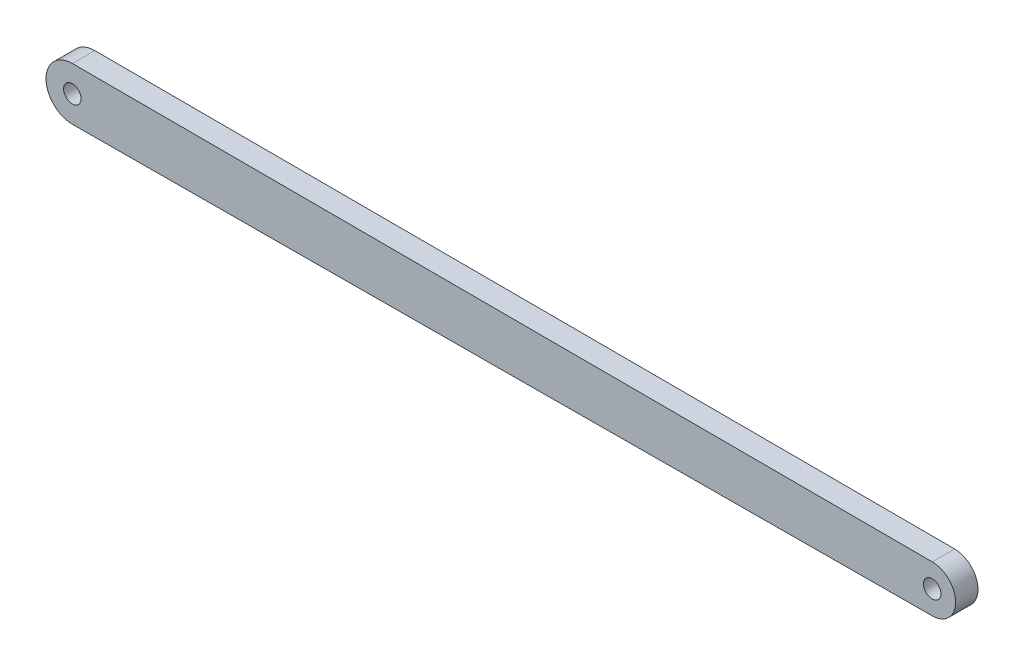
ISO-10303-21;
HEADER;
FILE_DESCRIPTION(('STEP AP214'),'2;1');
FILE_NAME('part.step','',(''),(''),'','','');
FILE_SCHEMA(('AUTOMOTIVE_DESIGN { 1 0 10303 214 1 1 1 1 }'));
ENDSEC;
DATA;
#1=APPLICATION_CONTEXT('core data for automotive mechanical design processes');
#2=APPLICATION_PROTOCOL_DEFINITION('international standard','automotive_design',2000,#1);
#3=PRODUCT_CONTEXT('',#1,'mechanical');
#4=PRODUCT('Part','Part','',(#3));
#5=PRODUCT_RELATED_PRODUCT_CATEGORY('part','',(#4));
#6=PRODUCT_DEFINITION_FORMATION('','',#4);
#7=PRODUCT_DEFINITION_CONTEXT('part definition',#1,'design');
#8=PRODUCT_DEFINITION('design','',#6,#7);
#9=PRODUCT_DEFINITION_SHAPE('','',#8);
#10=(LENGTH_UNIT() NAMED_UNIT(*) SI_UNIT(.MILLI.,.METRE.));
#11=(NAMED_UNIT(*) PLANE_ANGLE_UNIT() SI_UNIT($,.RADIAN.));
#12=(NAMED_UNIT(*) SI_UNIT($,.STERADIAN.) SOLID_ANGLE_UNIT());
#13=UNCERTAINTY_MEASURE_WITH_UNIT(LENGTH_MEASURE(1.E-05),#10,'distance_accuracy_value','');
#14=(GEOMETRIC_REPRESENTATION_CONTEXT(3) GLOBAL_UNCERTAINTY_ASSIGNED_CONTEXT((#13)) GLOBAL_UNIT_ASSIGNED_CONTEXT((#10,
#11,#12)) REPRESENTATION_CONTEXT('',''));
#15=CARTESIAN_POINT('',(0.,0.,0.));
#16=DIRECTION('',(0.,0.,1.));
#17=DIRECTION('',(1.,0.,0.));
#18=AXIS2_PLACEMENT_3D('',#15,#16,#17);
#19=CARTESIAN_POINT('',(-0.662328734431452,136.336625884489,6.35));
#20=DIRECTION('',(-0.00485798232582036,0.99998819993424,0.));
#21=DIRECTION('',(-0.99998819993424,-0.00485798232582036,0.));
#22=AXIS2_PLACEMENT_3D('',#19,#20,#21);
#23=PLANE('',#22);
#24=DIRECTION('',(0.99998819993424,0.00485798232582036,0.));
#25=VECTOR('',#24,1.);
#26=CARTESIAN_POINT('',(-0.662328734431452,136.336625884489,0.));
#27=LINE('',#26,#25);
#28=CARTESIAN_POINT('',(-142.715556523186,135.646525671338,0.));
#29=VERTEX_POINT('',#28);
#30=CARTESIAN_POINT('',(101.251015226787,136.83172495042,0.));
#31=VERTEX_POINT('',#30);
#32=EDGE_CURVE('E114',#29,#31,#27,.T.);
#33=ORIENTED_EDGE('',*,*,#32,.T.);
#34=DIRECTION('',(0.,0.,-1.));
#35=VECTOR('',#34,1.);
#36=CARTESIAN_POINT('',(101.251015226787,136.83172495042,6.35));
#37=LINE('',#36,#35);
#38=CARTESIAN_POINT('',(101.251015226787,136.83172495042,6.35));
#39=VERTEX_POINT('',#38);
#40=EDGE_CURVE('E11',#39,#31,#37,.T.);
#41=ORIENTED_EDGE('',*,*,#40,.F.);
#42=DIRECTION('',(0.99998819993424,0.00485798232582036,0.));
#43=VECTOR('',#42,1.);
#44=CARTESIAN_POINT('',(-0.662328734431452,136.336625884489,6.35));
#45=LINE('',#44,#43);
#46=CARTESIAN_POINT('',(-142.715556523186,135.646525671338,6.35));
#47=VERTEX_POINT('',#46);
#48=EDGE_CURVE('E93',#47,#39,#45,.T.);
#49=ORIENTED_EDGE('',*,*,#48,.F.);
#50=DIRECTION('',(0.,0.,-1.));
#51=VECTOR('',#50,1.);
#52=CARTESIAN_POINT('',(-142.715556523186,135.646525671338,6.35));
#53=LINE('',#52,#51);
#54=EDGE_CURVE('E113',#47,#29,#53,.T.);
#55=ORIENTED_EDGE('',*,*,#54,.T.);
#56=EDGE_LOOP('',(#33,#41,#49,#55));
#57=FACE_BOUND('',#56,.T.);
#58=ADVANCED_FACE('F45',(#57),#23,.F.);
#59=CARTESIAN_POINT('',(101.218768587839,143.469513289823,6.35));
#60=DIRECTION('',(0.,0.,-1.));
#61=DIRECTION('',(-1.,0.,0.));
#62=AXIS2_PLACEMENT_3D('',#59,#60,#61);
#63=CYLINDRICAL_SURFACE('',#62,6.63786666666665);
#64=CARTESIAN_POINT('',(101.218768587839,143.469513289823,0.));
#65=DIRECTION('',(0.,0.,1.));
#66=DIRECTION('',(1.,0.,0.));
#67=AXIS2_PLACEMENT_3D('',#64,#65,#66);
#68=CIRCLE('',#67,6.63786666666665);
#69=CARTESIAN_POINT('',(101.231672040621,150.107367414866,0.));
#70=VERTEX_POINT('',#69);
#71=EDGE_CURVE('E98',#31,#70,#68,.T.);
#72=ORIENTED_EDGE('',*,*,#71,.T.);
#73=DIRECTION('',(0.,0.,-1.));
#74=VECTOR('',#73,1.);
#75=CARTESIAN_POINT('',(101.231672040621,150.107367414866,6.35));
#76=LINE('',#75,#74);
#77=CARTESIAN_POINT('',(101.231672040621,150.107367414866,6.35));
#78=VERTEX_POINT('',#77);
#79=EDGE_CURVE('E53',#78,#70,#76,.T.);
#80=ORIENTED_EDGE('',*,*,#79,.F.);
#81=CARTESIAN_POINT('',(101.218768587839,143.469513289823,6.35));
#82=DIRECTION('',(0.,0.,1.));
#83=DIRECTION('',(1.,0.,0.));
#84=AXIS2_PLACEMENT_3D('',#81,#82,#83);
#85=CIRCLE('',#84,6.63786666666665);
#86=EDGE_CURVE('E87',#39,#78,#85,.T.);
#87=ORIENTED_EDGE('',*,*,#86,.F.);
#88=ORIENTED_EDGE('',*,*,#40,.T.);
#89=EDGE_LOOP('',(#72,#80,#87,#88));
#90=FACE_BOUND('',#89,.T.);
#91=ADVANCED_FACE('F97',(#90),#63,.T.);
#92=CARTESIAN_POINT('',(0.292178041855998,150.30358564596,6.35));
#93=DIRECTION('',(0.00194391563286681,0.999998110594221,0.));
#94=DIRECTION('',(-0.999998110594221,0.00194391563286681,0.));
#95=AXIS2_PLACEMENT_3D('',#92,#93,#94);
#96=PLANE('',#95);
#97=DIRECTION('',(0.999998110594221,-0.00194391563286681,0.));
#98=VECTOR('',#97,1.);
#99=CARTESIAN_POINT('',(0.292178041855998,150.30358564596,0.));
#100=LINE('',#99,#98);
#101=CARTESIAN_POINT('',(-142.737317607622,150.58162344384,0.));
#102=VERTEX_POINT('',#101);
#103=EDGE_CURVE('E118',#102,#70,#100,.T.);
#104=ORIENTED_EDGE('',*,*,#103,.F.);
#105=DIRECTION('',(0.,0.,-1.));
#106=VECTOR('',#105,1.);
#107=CARTESIAN_POINT('',(-142.737317607622,150.58162344384,6.35));
#108=LINE('',#107,#106);
#109=CARTESIAN_POINT('',(-142.737317607622,150.58162344384,6.35));
#110=VERTEX_POINT('',#109);
#111=EDGE_CURVE('E77',#110,#102,#108,.T.);
#112=ORIENTED_EDGE('',*,*,#111,.F.);
#113=DIRECTION('',(0.999998110594221,-0.00194391563286681,0.));
#114=VECTOR('',#113,1.);
#115=CARTESIAN_POINT('',(0.292178041855998,150.30358564596,6.35));
#116=LINE('',#115,#114);
#117=EDGE_CURVE('E91',#110,#78,#116,.T.);
#118=ORIENTED_EDGE('',*,*,#117,.T.);
#119=ORIENTED_EDGE('',*,*,#79,.T.);
#120=EDGE_LOOP('',(#104,#112,#118,#119));
#121=FACE_BOUND('',#120,.T.);
#122=ADVANCED_FACE('F102',(#121),#96,.T.);
#123=CARTESIAN_POINT('',(-142.751833992002,143.114037553167,6.35));
#124=DIRECTION('',(0.,0.,-1.));
#125=DIRECTION('',(-1.,0.,0.));
#126=AXIS2_PLACEMENT_3D('',#123,#124,#125);
#127=CYLINDRICAL_SURFACE('',#126,2.48920000010306);
#128=CARTESIAN_POINT('',(-142.751833992002,143.114037553167,6.35));
#129=DIRECTION('',(0.,0.,1.));
#130=DIRECTION('',(1.,0.,0.));
#131=AXIS2_PLACEMENT_3D('',#128,#129,#130);
#132=CIRCLE('',#131,2.48920000010306);
#133=CARTESIAN_POINT('',(-140.262633991899,143.114037553167,6.35));
#134=VERTEX_POINT('',#133);
#135=EDGE_CURVE('E104',#134,#134,#132,.T.);
#136=ORIENTED_EDGE('',*,*,#135,.T.);
#137=EDGE_LOOP('',(#136));
#138=FACE_BOUND('',#137,.T.);
#139=CARTESIAN_POINT('',(-142.751833992002,143.114037553167,0.));
#140=DIRECTION('',(0.,0.,1.));
#141=DIRECTION('',(1.,0.,0.));
#142=AXIS2_PLACEMENT_3D('',#139,#140,#141);
#143=CIRCLE('',#142,2.48920000010306);
#144=CARTESIAN_POINT('',(-140.262633991899,143.114037553167,0.));
#145=VERTEX_POINT('',#144);
#146=EDGE_CURVE('E121',#145,#145,#143,.T.);
#147=ORIENTED_EDGE('',*,*,#146,.F.);
#148=EDGE_LOOP('',(#147));
#149=FACE_BOUND('',#148,.T.);
#150=ADVANCED_FACE('F149',(#138,#149),#127,.F.);
#151=CARTESIAN_POINT('',(-142.751833992002,143.114037553167,6.35));
#152=DIRECTION('',(0.,0.,-1.));
#153=DIRECTION('',(-1.,0.,0.));
#154=AXIS2_PLACEMENT_3D('',#151,#152,#153);
#155=CYLINDRICAL_SURFACE('',#154,7.46759999999998);
#156=CARTESIAN_POINT('',(-142.751833992002,143.114037553167,0.));
#157=DIRECTION('',(0.,0.,1.));
#158=DIRECTION('',(1.,0.,0.));
#159=AXIS2_PLACEMENT_3D('',#156,#157,#158);
#160=CIRCLE('',#159,7.46759999999998);
#161=EDGE_CURVE('E80',#102,#29,#160,.T.);
#162=ORIENTED_EDGE('',*,*,#161,.T.);
#163=ORIENTED_EDGE('',*,*,#54,.F.);
#164=CARTESIAN_POINT('',(-142.751833992002,143.114037553167,6.35));
#165=DIRECTION('',(0.,0.,1.));
#166=DIRECTION('',(1.,0.,0.));
#167=AXIS2_PLACEMENT_3D('',#164,#165,#166);
#168=CIRCLE('',#167,7.46759999999998);
#169=EDGE_CURVE('E61',#110,#47,#168,.T.);
#170=ORIENTED_EDGE('',*,*,#169,.F.);
#171=ORIENTED_EDGE('',*,*,#111,.T.);
#172=EDGE_LOOP('',(#162,#163,#170,#171));
#173=FACE_BOUND('',#172,.T.);
#174=ADVANCED_FACE('F141',(#173),#155,.T.);
#175=CARTESIAN_POINT('',(101.218768587839,143.469513289823,6.35));
#176=DIRECTION('',(0.,0.,-1.));
#177=DIRECTION('',(-1.,0.,0.));
#178=AXIS2_PLACEMENT_3D('',#175,#176,#177);
#179=CYLINDRICAL_SURFACE('',#178,2.48920000000001);
#180=CARTESIAN_POINT('',(101.218768587839,143.469513289823,6.35));
#181=DIRECTION('',(0.,0.,1.));
#182=DIRECTION('',(1.,0.,0.));
#183=AXIS2_PLACEMENT_3D('',#180,#181,#182);
#184=CIRCLE('',#183,2.48920000000001);
#185=CARTESIAN_POINT('',(103.707968587839,143.469513289823,6.35));
#186=VERTEX_POINT('',#185);
#187=EDGE_CURVE('E110',#186,#186,#184,.T.);
#188=ORIENTED_EDGE('',*,*,#187,.T.);
#189=EDGE_LOOP('',(#188));
#190=FACE_BOUND('',#189,.T.);
#191=CARTESIAN_POINT('',(101.218768587839,143.469513289823,0.));
#192=DIRECTION('',(0.,0.,1.));
#193=DIRECTION('',(1.,0.,0.));
#194=AXIS2_PLACEMENT_3D('',#191,#192,#193);
#195=CIRCLE('',#194,2.48920000000001);
#196=CARTESIAN_POINT('',(103.707968587839,143.469513289823,0.));
#197=VERTEX_POINT('',#196);
#198=EDGE_CURVE('E124',#197,#197,#195,.T.);
#199=ORIENTED_EDGE('',*,*,#198,.F.);
#200=EDGE_LOOP('',(#199));
#201=FACE_BOUND('',#200,.T.);
#202=ADVANCED_FACE('F139',(#190,#201),#179,.F.);
#203=CARTESIAN_POINT('',(0.,0.,6.35));
#204=DIRECTION('',(0.,0.,1.));
#205=DIRECTION('',(1.,0.,0.));
#206=AXIS2_PLACEMENT_3D('',#203,#204,#205);
#207=PLANE('',#206);
#208=ORIENTED_EDGE('',*,*,#48,.T.);
#209=ORIENTED_EDGE('',*,*,#86,.T.);
#210=ORIENTED_EDGE('',*,*,#117,.F.);
#211=ORIENTED_EDGE('',*,*,#169,.T.);
#212=EDGE_LOOP('',(#208,#209,#210,#211));
#213=FACE_BOUND('',#212,.T.);
#214=ORIENTED_EDGE('',*,*,#135,.F.);
#215=EDGE_LOOP('',(#214));
#216=FACE_BOUND('',#215,.T.);
#217=ORIENTED_EDGE('',*,*,#187,.F.);
#218=EDGE_LOOP('',(#217));
#219=FACE_BOUND('',#218,.T.);
#220=ADVANCED_FACE('F88',(#213,#216,#219),#207,.T.);
#221=CARTESIAN_POINT('',(0.,0.,0.));
#222=DIRECTION('',(0.,0.,1.));
#223=DIRECTION('',(1.,0.,0.));
#224=AXIS2_PLACEMENT_3D('',#221,#222,#223);
#225=PLANE('',#224);
#226=ORIENTED_EDGE('',*,*,#32,.F.);
#227=ORIENTED_EDGE('',*,*,#161,.F.);
#228=ORIENTED_EDGE('',*,*,#103,.T.);
#229=ORIENTED_EDGE('',*,*,#71,.F.);
#230=EDGE_LOOP('',(#226,#227,#228,#229));
#231=FACE_BOUND('',#230,.T.);
#232=ORIENTED_EDGE('',*,*,#146,.T.);
#233=EDGE_LOOP('',(#232));
#234=FACE_BOUND('',#233,.T.);
#235=ORIENTED_EDGE('',*,*,#198,.T.);
#236=EDGE_LOOP('',(#235));
#237=FACE_BOUND('',#236,.T.);
#238=ADVANCED_FACE('F131',(#231,#234,#237),#225,.F.);
#239=CLOSED_SHELL('',(#58,#91,#122,#150,#174,#202,#220,#238));
#240=MANIFOLD_SOLID_BREP('B2',#239);
#241=ADVANCED_BREP_SHAPE_REPRESENTATION('',(#18,#240),#14);
#242=SHAPE_DEFINITION_REPRESENTATION(#9,#241);
ENDSEC;
END-ISO-10303-21;
